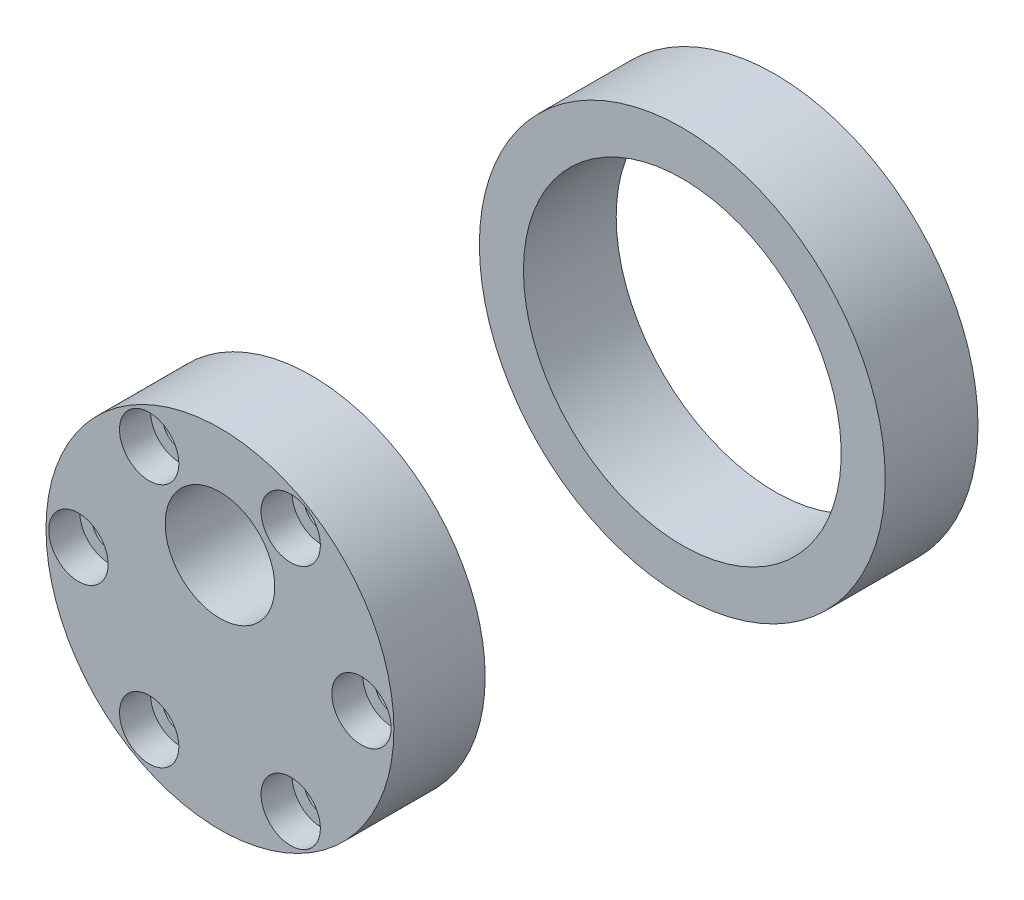
ISO-10303-21;
HEADER;
FILE_DESCRIPTION(('STEP AP214'),'2;1');
FILE_NAME('part.step','',(''),(''),'','','');
FILE_SCHEMA(('AUTOMOTIVE_DESIGN { 1 0 10303 214 1 1 1 1 }'));
ENDSEC;
DATA;
#1=APPLICATION_CONTEXT('core data for automotive mechanical design processes');
#2=APPLICATION_PROTOCOL_DEFINITION('international standard','automotive_design',2000,#1);
#3=PRODUCT_CONTEXT('',#1,'mechanical');
#4=PRODUCT('Part','Part','',(#3));
#5=PRODUCT_RELATED_PRODUCT_CATEGORY('part','',(#4));
#6=PRODUCT_DEFINITION_FORMATION('','',#4);
#7=PRODUCT_DEFINITION_CONTEXT('part definition',#1,'design');
#8=PRODUCT_DEFINITION('design','',#6,#7);
#9=PRODUCT_DEFINITION_SHAPE('','',#8);
#10=(LENGTH_UNIT() NAMED_UNIT(*) SI_UNIT(.MILLI.,.METRE.));
#11=(NAMED_UNIT(*) PLANE_ANGLE_UNIT() SI_UNIT($,.RADIAN.));
#12=(NAMED_UNIT(*) SI_UNIT($,.STERADIAN.) SOLID_ANGLE_UNIT());
#13=UNCERTAINTY_MEASURE_WITH_UNIT(LENGTH_MEASURE(1.E-05),#10,'distance_accuracy_value','');
#14=(GEOMETRIC_REPRESENTATION_CONTEXT(3) GLOBAL_UNCERTAINTY_ASSIGNED_CONTEXT((#13)) GLOBAL_UNIT_ASSIGNED_CONTEXT((#10,
#11,#12)) REPRESENTATION_CONTEXT('',''));
#15=CARTESIAN_POINT('',(0.,0.,0.));
#16=DIRECTION('',(0.,0.,1.));
#17=DIRECTION('',(1.,0.,0.));
#18=AXIS2_PLACEMENT_3D('',#15,#16,#17);
#19=CARTESIAN_POINT('',(0.,0.,-50.8));
#20=DIRECTION('',(0.,0.,-1.));
#21=DIRECTION('',(-1.,0.,0.));
#22=AXIS2_PLACEMENT_3D('',#19,#20,#21);
#23=PLANE('',#22);
#24=CARTESIAN_POINT('',(0.,0.,-50.8));
#25=DIRECTION('',(0.,0.,-1.));
#26=DIRECTION('',(-1.,0.,0.));
#27=AXIS2_PLACEMENT_3D('',#24,#25,#26);
#28=CIRCLE('',#27,22.225);
#29=CARTESIAN_POINT('',(-22.225,0.,-50.8));
#30=VERTEX_POINT('',#29);
#31=EDGE_CURVE('E11',#30,#30,#28,.T.);
#32=ORIENTED_EDGE('',*,*,#31,.T.);
#33=EDGE_LOOP('',(#32));
#34=FACE_BOUND('',#33,.T.);
#35=CARTESIAN_POINT('',(0.,0.,-50.8));
#36=DIRECTION('',(0.,0.,-1.));
#37=DIRECTION('',(-1.,0.,0.));
#38=AXIS2_PLACEMENT_3D('',#35,#36,#37);
#39=CIRCLE('',#38,17.4);
#40=CARTESIAN_POINT('',(-17.4,0.,-50.8));
#41=VERTEX_POINT('',#40);
#42=EDGE_CURVE('E61',#41,#41,#39,.T.);
#43=ORIENTED_EDGE('',*,*,#42,.F.);
#44=EDGE_LOOP('',(#43));
#45=FACE_BOUND('',#44,.T.);
#46=ADVANCED_FACE('F50',(#34,#45),#23,.T.);
#47=CARTESIAN_POINT('',(0.,0.,-40.64));
#48=DIRECTION('',(0.,0.,-1.));
#49=DIRECTION('',(-1.,0.,0.));
#50=AXIS2_PLACEMENT_3D('',#47,#48,#49);
#51=PLANE('',#50);
#52=CARTESIAN_POINT('',(0.,0.,-40.64));
#53=DIRECTION('',(0.,0.,-1.));
#54=DIRECTION('',(-1.,0.,0.));
#55=AXIS2_PLACEMENT_3D('',#52,#53,#54);
#56=CIRCLE('',#55,22.225);
#57=CARTESIAN_POINT('',(-22.225,0.,-40.64));
#58=VERTEX_POINT('',#57);
#59=EDGE_CURVE('E54',#58,#58,#56,.T.);
#60=ORIENTED_EDGE('',*,*,#59,.F.);
#61=EDGE_LOOP('',(#60));
#62=FACE_BOUND('',#61,.T.);
#63=CARTESIAN_POINT('',(0.,0.,-40.64));
#64=DIRECTION('',(0.,0.,-1.));
#65=DIRECTION('',(-1.,0.,0.));
#66=AXIS2_PLACEMENT_3D('',#63,#64,#65);
#67=CIRCLE('',#66,17.4);
#68=CARTESIAN_POINT('',(-17.4,0.,-40.64));
#69=VERTEX_POINT('',#68);
#70=EDGE_CURVE('E63',#69,#69,#67,.T.);
#71=ORIENTED_EDGE('',*,*,#70,.T.);
#72=EDGE_LOOP('',(#71));
#73=FACE_BOUND('',#72,.T.);
#74=ADVANCED_FACE('F73',(#62,#73),#51,.F.);
#75=CARTESIAN_POINT('',(0.,0.,-50.8));
#76=DIRECTION('',(0.,0.,1.));
#77=DIRECTION('',(1.,0.,0.));
#78=AXIS2_PLACEMENT_3D('',#75,#76,#77);
#79=CYLINDRICAL_SURFACE('',#78,22.225);
#80=ORIENTED_EDGE('',*,*,#31,.F.);
#81=EDGE_LOOP('',(#80));
#82=FACE_BOUND('',#81,.T.);
#83=ORIENTED_EDGE('',*,*,#59,.T.);
#84=EDGE_LOOP('',(#83));
#85=FACE_BOUND('',#84,.T.);
#86=ADVANCED_FACE('F52',(#82,#85),#79,.T.);
#87=CARTESIAN_POINT('',(0.,0.,-50.8));
#88=DIRECTION('',(0.,0.,1.));
#89=DIRECTION('',(1.,0.,0.));
#90=AXIS2_PLACEMENT_3D('',#87,#88,#89);
#91=CYLINDRICAL_SURFACE('',#90,17.4);
#92=ORIENTED_EDGE('',*,*,#42,.T.);
#93=EDGE_LOOP('',(#92));
#94=FACE_BOUND('',#93,.T.);
#95=ORIENTED_EDGE('',*,*,#70,.F.);
#96=EDGE_LOOP('',(#95));
#97=FACE_BOUND('',#96,.T.);
#98=ADVANCED_FACE('F69',(#94,#97),#91,.F.);
#99=CLOSED_SHELL('',(#46,#74,#86,#98));
#100=MANIFOLD_SOLID_BREP('B2',#99);
#101=CARTESIAN_POINT('',(0.,0.,10.));
#102=DIRECTION('',(0.,0.,1.));
#103=DIRECTION('',(1.,0.,0.));
#104=AXIS2_PLACEMENT_3D('',#101,#102,#103);
#105=PLANE('',#104);
#106=CARTESIAN_POINT('',(-7.75,-13.4233937586588,10.));
#107=DIRECTION('',(0.,0.,1.));
#108=DIRECTION('',(1.,0.,0.));
#109=AXIS2_PLACEMENT_3D('',#106,#107,#108);
#110=CIRCLE('',#109,3.25);
#111=CARTESIAN_POINT('',(-4.5,-13.4233937586588,10.));
#112=VERTEX_POINT('',#111);
#113=EDGE_CURVE('E252',#112,#112,#110,.T.);
#114=ORIENTED_EDGE('',*,*,#113,.F.);
#115=EDGE_LOOP('',(#114));
#116=FACE_BOUND('',#115,.T.);
#117=CARTESIAN_POINT('',(-15.5,0.,10.));
#118=DIRECTION('',(0.,0.,1.));
#119=DIRECTION('',(1.,0.,0.));
#120=AXIS2_PLACEMENT_3D('',#117,#118,#119);
#121=CIRCLE('',#120,3.25);
#122=CARTESIAN_POINT('',(-12.25,0.,10.));
#123=VERTEX_POINT('',#122);
#124=EDGE_CURVE('E167',#123,#123,#121,.T.);
#125=ORIENTED_EDGE('',*,*,#124,.F.);
#126=EDGE_LOOP('',(#125));
#127=FACE_BOUND('',#126,.T.);
#128=CARTESIAN_POINT('',(-7.75000000000001,13.4233937586588,10.));
#129=DIRECTION('',(0.,0.,1.));
#130=DIRECTION('',(1.,0.,0.));
#131=AXIS2_PLACEMENT_3D('',#128,#129,#130);
#132=CIRCLE('',#131,3.25);
#133=CARTESIAN_POINT('',(-4.50000000000001,13.4233937586588,10.));
#134=VERTEX_POINT('',#133);
#135=EDGE_CURVE('E158',#134,#134,#132,.T.);
#136=ORIENTED_EDGE('',*,*,#135,.F.);
#137=EDGE_LOOP('',(#136));
#138=FACE_BOUND('',#137,.T.);
#139=CARTESIAN_POINT('',(7.75,13.4233937586588,10.));
#140=DIRECTION('',(0.,0.,1.));
#141=DIRECTION('',(1.,0.,0.));
#142=AXIS2_PLACEMENT_3D('',#139,#140,#141);
#143=CIRCLE('',#142,3.25);
#144=CARTESIAN_POINT('',(11.,13.4233937586588,10.));
#145=VERTEX_POINT('',#144);
#146=EDGE_CURVE('E153',#145,#145,#143,.T.);
#147=ORIENTED_EDGE('',*,*,#146,.F.);
#148=EDGE_LOOP('',(#147));
#149=FACE_BOUND('',#148,.T.);
#150=CARTESIAN_POINT('',(15.5,0.,10.));
#151=DIRECTION('',(0.,0.,1.));
#152=DIRECTION('',(1.,0.,0.));
#153=AXIS2_PLACEMENT_3D('',#150,#151,#152);
#154=CIRCLE('',#153,3.25);
#155=CARTESIAN_POINT('',(18.75,0.,10.));
#156=VERTEX_POINT('',#155);
#157=EDGE_CURVE('E148',#156,#156,#154,.T.);
#158=ORIENTED_EDGE('',*,*,#157,.F.);
#159=EDGE_LOOP('',(#158));
#160=FACE_BOUND('',#159,.T.);
#161=CARTESIAN_POINT('',(7.75,-13.4233937586588,10.));
#162=DIRECTION('',(0.,0.,1.));
#163=DIRECTION('',(1.,0.,0.));
#164=AXIS2_PLACEMENT_3D('',#161,#162,#163);
#165=CIRCLE('',#164,3.25);
#166=CARTESIAN_POINT('',(11.,-13.4233937586588,10.));
#167=VERTEX_POINT('',#166);
#168=EDGE_CURVE('E142',#167,#167,#165,.T.);
#169=ORIENTED_EDGE('',*,*,#168,.F.);
#170=EDGE_LOOP('',(#169));
#171=FACE_BOUND('',#170,.T.);
#172=CARTESIAN_POINT('',(0.,0.,10.));
#173=DIRECTION('',(0.,0.,1.));
#174=DIRECTION('',(1.,0.,0.));
#175=AXIS2_PLACEMENT_3D('',#172,#173,#174);
#176=CIRCLE('',#175,19.05);
#177=CARTESIAN_POINT('',(19.05,0.,10.));
#178=VERTEX_POINT('',#177);
#179=EDGE_CURVE('E49',#178,#178,#176,.T.);
#180=ORIENTED_EDGE('',*,*,#179,.T.);
#181=EDGE_LOOP('',(#180));
#182=FACE_BOUND('',#181,.T.);
#183=CARTESIAN_POINT('',(0.,7.,10.));
#184=DIRECTION('',(0.,0.,1.));
#185=DIRECTION('',(1.,0.,0.));
#186=AXIS2_PLACEMENT_3D('',#183,#184,#185);
#187=CIRCLE('',#186,6.);
#188=CARTESIAN_POINT('',(6.,7.,10.));
#189=VERTEX_POINT('',#188);
#190=EDGE_CURVE('E126',#189,#189,#187,.T.);
#191=ORIENTED_EDGE('',*,*,#190,.F.);
#192=EDGE_LOOP('',(#191));
#193=FACE_BOUND('',#192,.T.);
#194=ADVANCED_FACE('F111',(#116,#127,#138,#149,#160,#171,#182,#193),#105,.T.);
#195=CARTESIAN_POINT('',(0.,0.,0.));
#196=DIRECTION('',(0.,0.,1.));
#197=DIRECTION('',(1.,0.,0.));
#198=AXIS2_PLACEMENT_3D('',#195,#196,#197);
#199=PLANE('',#198);
#200=CARTESIAN_POINT('',(0.,0.,0.));
#201=DIRECTION('',(0.,0.,1.));
#202=DIRECTION('',(1.,0.,0.));
#203=AXIS2_PLACEMENT_3D('',#200,#201,#202);
#204=CIRCLE('',#203,19.05);
#205=CARTESIAN_POINT('',(19.05,0.,0.));
#206=VERTEX_POINT('',#205);
#207=EDGE_CURVE('E120',#206,#206,#204,.T.);
#208=ORIENTED_EDGE('',*,*,#207,.F.);
#209=EDGE_LOOP('',(#208));
#210=FACE_BOUND('',#209,.T.);
#211=CARTESIAN_POINT('',(0.,7.,0.));
#212=DIRECTION('',(0.,0.,1.));
#213=DIRECTION('',(1.,0.,0.));
#214=AXIS2_PLACEMENT_3D('',#211,#212,#213);
#215=CIRCLE('',#214,6.);
#216=CARTESIAN_POINT('',(6.,7.,0.));
#217=VERTEX_POINT('',#216);
#218=EDGE_CURVE('E129',#217,#217,#215,.T.);
#219=ORIENTED_EDGE('',*,*,#218,.T.);
#220=EDGE_LOOP('',(#219));
#221=FACE_BOUND('',#220,.T.);
#222=CARTESIAN_POINT('',(15.5,0.,0.));
#223=DIRECTION('',(0.,0.,1.));
#224=DIRECTION('',(1.,0.,0.));
#225=AXIS2_PLACEMENT_3D('',#222,#223,#224);
#226=CIRCLE('',#225,1.905);
#227=CARTESIAN_POINT('',(17.405,0.,0.));
#228=VERTEX_POINT('',#227);
#229=EDGE_CURVE('E216',#228,#228,#226,.T.);
#230=ORIENTED_EDGE('',*,*,#229,.T.);
#231=EDGE_LOOP('',(#230));
#232=FACE_BOUND('',#231,.T.);
#233=CARTESIAN_POINT('',(7.75,-13.4233937586588,0.));
#234=DIRECTION('',(0.,0.,1.));
#235=DIRECTION('',(1.,0.,0.));
#236=AXIS2_PLACEMENT_3D('',#233,#234,#235);
#237=CIRCLE('',#236,1.905);
#238=CARTESIAN_POINT('',(9.655,-13.4233937586588,0.));
#239=VERTEX_POINT('',#238);
#240=EDGE_CURVE('E212',#239,#239,#237,.T.);
#241=ORIENTED_EDGE('',*,*,#240,.T.);
#242=EDGE_LOOP('',(#241));
#243=FACE_BOUND('',#242,.T.);
#244=CARTESIAN_POINT('',(-7.75,-13.4233937586588,0.));
#245=DIRECTION('',(0.,0.,1.));
#246=DIRECTION('',(1.,0.,0.));
#247=AXIS2_PLACEMENT_3D('',#244,#245,#246);
#248=CIRCLE('',#247,1.905);
#249=CARTESIAN_POINT('',(-5.845,-13.4233937586588,0.));
#250=VERTEX_POINT('',#249);
#251=EDGE_CURVE('E208',#250,#250,#248,.T.);
#252=ORIENTED_EDGE('',*,*,#251,.T.);
#253=EDGE_LOOP('',(#252));
#254=FACE_BOUND('',#253,.T.);
#255=CARTESIAN_POINT('',(-15.5,0.,0.));
#256=DIRECTION('',(0.,0.,1.));
#257=DIRECTION('',(1.,0.,0.));
#258=AXIS2_PLACEMENT_3D('',#255,#256,#257);
#259=CIRCLE('',#258,1.905);
#260=CARTESIAN_POINT('',(-13.595,0.,0.));
#261=VERTEX_POINT('',#260);
#262=EDGE_CURVE('E204',#261,#261,#259,.T.);
#263=ORIENTED_EDGE('',*,*,#262,.T.);
#264=EDGE_LOOP('',(#263));
#265=FACE_BOUND('',#264,.T.);
#266=CARTESIAN_POINT('',(-7.75000000000001,13.4233937586588,0.));
#267=DIRECTION('',(0.,0.,1.));
#268=DIRECTION('',(1.,0.,0.));
#269=AXIS2_PLACEMENT_3D('',#266,#267,#268);
#270=CIRCLE('',#269,1.905);
#271=CARTESIAN_POINT('',(-5.84500000000001,13.4233937586588,0.));
#272=VERTEX_POINT('',#271);
#273=EDGE_CURVE('E200',#272,#272,#270,.T.);
#274=ORIENTED_EDGE('',*,*,#273,.T.);
#275=EDGE_LOOP('',(#274));
#276=FACE_BOUND('',#275,.T.);
#277=CARTESIAN_POINT('',(7.75,13.4233937586588,0.));
#278=DIRECTION('',(0.,0.,1.));
#279=DIRECTION('',(1.,0.,0.));
#280=AXIS2_PLACEMENT_3D('',#277,#278,#279);
#281=CIRCLE('',#280,1.905);
#282=CARTESIAN_POINT('',(9.655,13.4233937586588,0.));
#283=VERTEX_POINT('',#282);
#284=EDGE_CURVE('E136',#283,#283,#281,.T.);
#285=ORIENTED_EDGE('',*,*,#284,.T.);
#286=EDGE_LOOP('',(#285));
#287=FACE_BOUND('',#286,.T.);
#288=ADVANCED_FACE('F227',(#210,#221,#232,#243,#254,#265,#276,#287),#199,.F.);
#289=CARTESIAN_POINT('',(0.,0.,10.));
#290=DIRECTION('',(0.,0.,-1.));
#291=DIRECTION('',(-1.,0.,0.));
#292=AXIS2_PLACEMENT_3D('',#289,#290,#291);
#293=CYLINDRICAL_SURFACE('',#292,19.05);
#294=ORIENTED_EDGE('',*,*,#179,.F.);
#295=EDGE_LOOP('',(#294));
#296=FACE_BOUND('',#295,.T.);
#297=ORIENTED_EDGE('',*,*,#207,.T.);
#298=EDGE_LOOP('',(#297));
#299=FACE_BOUND('',#298,.T.);
#300=ADVANCED_FACE('F113',(#296,#299),#293,.T.);
#301=CARTESIAN_POINT('',(0.,7.,10.));
#302=DIRECTION('',(0.,0.,-1.));
#303=DIRECTION('',(-1.,0.,0.));
#304=AXIS2_PLACEMENT_3D('',#301,#302,#303);
#305=CYLINDRICAL_SURFACE('',#304,6.);
#306=ORIENTED_EDGE('',*,*,#190,.T.);
#307=EDGE_LOOP('',(#306));
#308=FACE_BOUND('',#307,.T.);
#309=ORIENTED_EDGE('',*,*,#218,.F.);
#310=EDGE_LOOP('',(#309));
#311=FACE_BOUND('',#310,.T.);
#312=ADVANCED_FACE('F230',(#308,#311),#305,.F.);
#313=CARTESIAN_POINT('',(15.5,0.,10.));
#314=DIRECTION('',(0.,0.,-1.));
#315=DIRECTION('',(-1.,0.,0.));
#316=AXIS2_PLACEMENT_3D('',#313,#314,#315);
#317=CYLINDRICAL_SURFACE('',#316,1.905);
#318=CARTESIAN_POINT('',(15.5,0.,6.6));
#319=DIRECTION('',(0.,0.,-1.));
#320=DIRECTION('',(-1.,0.,0.));
#321=AXIS2_PLACEMENT_3D('',#318,#319,#320);
#322=CIRCLE('',#321,1.905);
#323=CARTESIAN_POINT('',(13.595,0.,6.6));
#324=VERTEX_POINT('',#323);
#325=EDGE_CURVE('E138',#324,#324,#322,.T.);
#326=ORIENTED_EDGE('',*,*,#325,.F.);
#327=EDGE_LOOP('',(#326));
#328=FACE_BOUND('',#327,.T.);
#329=ORIENTED_EDGE('',*,*,#229,.F.);
#330=EDGE_LOOP('',(#329));
#331=FACE_BOUND('',#330,.T.);
#332=ADVANCED_FACE('F232',(#328,#331),#317,.F.);
#333=CARTESIAN_POINT('',(7.75,-13.4233937586588,10.));
#334=DIRECTION('',(0.,0.,-1.));
#335=DIRECTION('',(-1.,0.,0.));
#336=AXIS2_PLACEMENT_3D('',#333,#334,#335);
#337=CYLINDRICAL_SURFACE('',#336,1.905);
#338=CARTESIAN_POINT('',(7.75,-13.4233937586588,6.6));
#339=DIRECTION('',(0.,0.,-1.));
#340=DIRECTION('',(-1.,0.,0.));
#341=AXIS2_PLACEMENT_3D('',#338,#339,#340);
#342=CIRCLE('',#341,1.905);
#343=CARTESIAN_POINT('',(5.845,-13.4233937586588,6.6));
#344=VERTEX_POINT('',#343);
#345=EDGE_CURVE('E132',#344,#344,#342,.T.);
#346=ORIENTED_EDGE('',*,*,#345,.F.);
#347=EDGE_LOOP('',(#346));
#348=FACE_BOUND('',#347,.T.);
#349=ORIENTED_EDGE('',*,*,#240,.F.);
#350=EDGE_LOOP('',(#349));
#351=FACE_BOUND('',#350,.T.);
#352=ADVANCED_FACE('F239',(#348,#351),#337,.F.);
#353=CARTESIAN_POINT('',(-7.75,-13.4233937586588,10.));
#354=DIRECTION('',(0.,0.,-1.));
#355=DIRECTION('',(-1.,0.,0.));
#356=AXIS2_PLACEMENT_3D('',#353,#354,#355);
#357=CYLINDRICAL_SURFACE('',#356,1.905);
#358=CARTESIAN_POINT('',(-7.75,-13.4233937586588,6.6));
#359=DIRECTION('',(0.,0.,-1.));
#360=DIRECTION('',(-1.,0.,0.));
#361=AXIS2_PLACEMENT_3D('',#358,#359,#360);
#362=CIRCLE('',#361,1.905);
#363=CARTESIAN_POINT('',(-9.655,-13.4233937586588,6.6));
#364=VERTEX_POINT('',#363);
#365=EDGE_CURVE('E115',#364,#364,#362,.T.);
#366=ORIENTED_EDGE('',*,*,#365,.F.);
#367=EDGE_LOOP('',(#366));
#368=FACE_BOUND('',#367,.T.);
#369=ORIENTED_EDGE('',*,*,#251,.F.);
#370=EDGE_LOOP('',(#369));
#371=FACE_BOUND('',#370,.T.);
#372=ADVANCED_FACE('F293',(#368,#371),#357,.F.);
#373=CARTESIAN_POINT('',(-15.5,0.,10.));
#374=DIRECTION('',(0.,0.,-1.));
#375=DIRECTION('',(-1.,0.,0.));
#376=AXIS2_PLACEMENT_3D('',#373,#374,#375);
#377=CYLINDRICAL_SURFACE('',#376,1.905);
#378=CARTESIAN_POINT('',(-15.5,0.,6.6));
#379=DIRECTION('',(0.,0.,-1.));
#380=DIRECTION('',(-1.,0.,0.));
#381=AXIS2_PLACEMENT_3D('',#378,#379,#380);
#382=CIRCLE('',#381,1.905);
#383=CARTESIAN_POINT('',(-17.405,0.,6.6));
#384=VERTEX_POINT('',#383);
#385=EDGE_CURVE('E155',#384,#384,#382,.T.);
#386=ORIENTED_EDGE('',*,*,#385,.F.);
#387=EDGE_LOOP('',(#386));
#388=FACE_BOUND('',#387,.T.);
#389=ORIENTED_EDGE('',*,*,#262,.F.);
#390=EDGE_LOOP('',(#389));
#391=FACE_BOUND('',#390,.T.);
#392=ADVANCED_FACE('F289',(#388,#391),#377,.F.);
#393=CARTESIAN_POINT('',(-7.75000000000001,13.4233937586588,10.));
#394=DIRECTION('',(0.,0.,-1.));
#395=DIRECTION('',(-1.,0.,0.));
#396=AXIS2_PLACEMENT_3D('',#393,#394,#395);
#397=CYLINDRICAL_SURFACE('',#396,1.905);
#398=CARTESIAN_POINT('',(-7.75000000000001,13.4233937586588,6.6));
#399=DIRECTION('',(0.,0.,-1.));
#400=DIRECTION('',(-1.,0.,0.));
#401=AXIS2_PLACEMENT_3D('',#398,#399,#400);
#402=CIRCLE('',#401,1.905);
#403=CARTESIAN_POINT('',(-9.65500000000001,13.4233937586588,6.6));
#404=VERTEX_POINT('',#403);
#405=EDGE_CURVE('E150',#404,#404,#402,.T.);
#406=ORIENTED_EDGE('',*,*,#405,.F.);
#407=EDGE_LOOP('',(#406));
#408=FACE_BOUND('',#407,.T.);
#409=ORIENTED_EDGE('',*,*,#273,.F.);
#410=EDGE_LOOP('',(#409));
#411=FACE_BOUND('',#410,.T.);
#412=ADVANCED_FACE('F285',(#408,#411),#397,.F.);
#413=CARTESIAN_POINT('',(7.75,13.4233937586588,10.));
#414=DIRECTION('',(0.,0.,-1.));
#415=DIRECTION('',(-1.,0.,0.));
#416=AXIS2_PLACEMENT_3D('',#413,#414,#415);
#417=CYLINDRICAL_SURFACE('',#416,1.905);
#418=CARTESIAN_POINT('',(7.75,13.4233937586588,6.6));
#419=DIRECTION('',(0.,0.,-1.));
#420=DIRECTION('',(-1.,0.,0.));
#421=AXIS2_PLACEMENT_3D('',#418,#419,#420);
#422=CIRCLE('',#421,1.905);
#423=CARTESIAN_POINT('',(5.845,13.4233937586588,6.6));
#424=VERTEX_POINT('',#423);
#425=EDGE_CURVE('E144',#424,#424,#422,.T.);
#426=ORIENTED_EDGE('',*,*,#425,.F.);
#427=EDGE_LOOP('',(#426));
#428=FACE_BOUND('',#427,.T.);
#429=ORIENTED_EDGE('',*,*,#284,.F.);
#430=EDGE_LOOP('',(#429));
#431=FACE_BOUND('',#430,.T.);
#432=ADVANCED_FACE('F277',(#428,#431),#417,.F.);
#433=CARTESIAN_POINT('',(9.45,-13.4233937586588,6.6));
#434=DIRECTION('',(0.,0.,-1.));
#435=DIRECTION('',(-1.,0.,0.));
#436=AXIS2_PLACEMENT_3D('',#433,#434,#435);
#437=PLANE('',#436);
#438=ORIENTED_EDGE('',*,*,#345,.T.);
#439=EDGE_LOOP('',(#438));
#440=FACE_BOUND('',#439,.T.);
#441=CARTESIAN_POINT('',(7.75,-13.4233937586588,6.6));
#442=DIRECTION('',(0.,0.,1.));
#443=DIRECTION('',(1.,0.,0.));
#444=AXIS2_PLACEMENT_3D('',#441,#442,#443);
#445=CIRCLE('',#444,3.25);
#446=CARTESIAN_POINT('',(11.,-13.4233937586588,6.6));
#447=VERTEX_POINT('',#446);
#448=EDGE_CURVE('E137',#447,#447,#445,.T.);
#449=ORIENTED_EDGE('',*,*,#448,.T.);
#450=EDGE_LOOP('',(#449));
#451=FACE_BOUND('',#450,.T.);
#452=ADVANCED_FACE('F267',(#440,#451),#437,.F.);
#453=CARTESIAN_POINT('',(7.75,-13.4233937586588,10.));
#454=DIRECTION('',(0.,0.,1.));
#455=DIRECTION('',(1.,0.,0.));
#456=AXIS2_PLACEMENT_3D('',#453,#454,#455);
#457=CYLINDRICAL_SURFACE('',#456,3.25);
#458=ORIENTED_EDGE('',*,*,#448,.F.);
#459=EDGE_LOOP('',(#458));
#460=FACE_BOUND('',#459,.T.);
#461=ORIENTED_EDGE('',*,*,#168,.T.);
#462=EDGE_LOOP('',(#461));
#463=FACE_BOUND('',#462,.T.);
#464=ADVANCED_FACE('F264',(#460,#463),#457,.F.);
#465=CARTESIAN_POINT('',(17.2,0.,6.6));
#466=DIRECTION('',(0.,0.,-1.));
#467=DIRECTION('',(-1.,0.,0.));
#468=AXIS2_PLACEMENT_3D('',#465,#466,#467);
#469=PLANE('',#468);
#470=ORIENTED_EDGE('',*,*,#325,.T.);
#471=EDGE_LOOP('',(#470));
#472=FACE_BOUND('',#471,.T.);
#473=CARTESIAN_POINT('',(15.5,0.,6.6));
#474=DIRECTION('',(0.,0.,1.));
#475=DIRECTION('',(1.,0.,0.));
#476=AXIS2_PLACEMENT_3D('',#473,#474,#475);
#477=CIRCLE('',#476,3.25);
#478=CARTESIAN_POINT('',(18.75,0.,6.6));
#479=VERTEX_POINT('',#478);
#480=EDGE_CURVE('E143',#479,#479,#477,.T.);
#481=ORIENTED_EDGE('',*,*,#480,.T.);
#482=EDGE_LOOP('',(#481));
#483=FACE_BOUND('',#482,.T.);
#484=ADVANCED_FACE('F266',(#472,#483),#469,.F.);
#485=CARTESIAN_POINT('',(15.5,0.,10.));
#486=DIRECTION('',(0.,0.,1.));
#487=DIRECTION('',(1.,0.,0.));
#488=AXIS2_PLACEMENT_3D('',#485,#486,#487);
#489=CYLINDRICAL_SURFACE('',#488,3.25);
#490=ORIENTED_EDGE('',*,*,#480,.F.);
#491=EDGE_LOOP('',(#490));
#492=FACE_BOUND('',#491,.T.);
#493=ORIENTED_EDGE('',*,*,#157,.T.);
#494=EDGE_LOOP('',(#493));
#495=FACE_BOUND('',#494,.T.);
#496=ADVANCED_FACE('F274',(#492,#495),#489,.F.);
#497=CARTESIAN_POINT('',(9.45,13.4233937586588,6.6));
#498=DIRECTION('',(0.,0.,-1.));
#499=DIRECTION('',(-1.,0.,0.));
#500=AXIS2_PLACEMENT_3D('',#497,#498,#499);
#501=PLANE('',#500);
#502=ORIENTED_EDGE('',*,*,#425,.T.);
#503=EDGE_LOOP('',(#502));
#504=FACE_BOUND('',#503,.T.);
#505=CARTESIAN_POINT('',(7.75,13.4233937586588,6.6));
#506=DIRECTION('',(0.,0.,1.));
#507=DIRECTION('',(1.,0.,0.));
#508=AXIS2_PLACEMENT_3D('',#505,#506,#507);
#509=CIRCLE('',#508,3.25);
#510=CARTESIAN_POINT('',(11.,13.4233937586588,6.6));
#511=VERTEX_POINT('',#510);
#512=EDGE_CURVE('E149',#511,#511,#509,.T.);
#513=ORIENTED_EDGE('',*,*,#512,.T.);
#514=EDGE_LOOP('',(#513));
#515=FACE_BOUND('',#514,.T.);
#516=ADVANCED_FACE('F366',(#504,#515),#501,.F.);
#517=CARTESIAN_POINT('',(7.75,13.4233937586588,10.));
#518=DIRECTION('',(0.,0.,1.));
#519=DIRECTION('',(1.,0.,0.));
#520=AXIS2_PLACEMENT_3D('',#517,#518,#519);
#521=CYLINDRICAL_SURFACE('',#520,3.25);
#522=ORIENTED_EDGE('',*,*,#512,.F.);
#523=EDGE_LOOP('',(#522));
#524=FACE_BOUND('',#523,.T.);
#525=ORIENTED_EDGE('',*,*,#146,.T.);
#526=EDGE_LOOP('',(#525));
#527=FACE_BOUND('',#526,.T.);
#528=ADVANCED_FACE('F375',(#524,#527),#521,.F.);
#529=CARTESIAN_POINT('',(-6.05000000000001,13.4233937586588,6.6));
#530=DIRECTION('',(0.,0.,-1.));
#531=DIRECTION('',(-1.,0.,0.));
#532=AXIS2_PLACEMENT_3D('',#529,#530,#531);
#533=PLANE('',#532);
#534=ORIENTED_EDGE('',*,*,#405,.T.);
#535=EDGE_LOOP('',(#534));
#536=FACE_BOUND('',#535,.T.);
#537=CARTESIAN_POINT('',(-7.75000000000001,13.4233937586588,6.6));
#538=DIRECTION('',(0.,0.,1.));
#539=DIRECTION('',(1.,0.,0.));
#540=AXIS2_PLACEMENT_3D('',#537,#538,#539);
#541=CIRCLE('',#540,3.25);
#542=CARTESIAN_POINT('',(-4.50000000000001,13.4233937586588,6.6));
#543=VERTEX_POINT('',#542);
#544=EDGE_CURVE('E154',#543,#543,#541,.T.);
#545=ORIENTED_EDGE('',*,*,#544,.T.);
#546=EDGE_LOOP('',(#545));
#547=FACE_BOUND('',#546,.T.);
#548=ADVANCED_FACE('F385',(#536,#547),#533,.F.);
#549=CARTESIAN_POINT('',(-7.75000000000001,13.4233937586588,10.));
#550=DIRECTION('',(0.,0.,1.));
#551=DIRECTION('',(1.,0.,0.));
#552=AXIS2_PLACEMENT_3D('',#549,#550,#551);
#553=CYLINDRICAL_SURFACE('',#552,3.25);
#554=ORIENTED_EDGE('',*,*,#544,.F.);
#555=EDGE_LOOP('',(#554));
#556=FACE_BOUND('',#555,.T.);
#557=ORIENTED_EDGE('',*,*,#135,.T.);
#558=EDGE_LOOP('',(#557));
#559=FACE_BOUND('',#558,.T.);
#560=ADVANCED_FACE('F395',(#556,#559),#553,.F.);
#561=CARTESIAN_POINT('',(-13.8,0.,6.6));
#562=DIRECTION('',(0.,0.,-1.));
#563=DIRECTION('',(-1.,0.,0.));
#564=AXIS2_PLACEMENT_3D('',#561,#562,#563);
#565=PLANE('',#564);
#566=ORIENTED_EDGE('',*,*,#385,.T.);
#567=EDGE_LOOP('',(#566));
#568=FACE_BOUND('',#567,.T.);
#569=CARTESIAN_POINT('',(-15.5,0.,6.6));
#570=DIRECTION('',(0.,0.,1.));
#571=DIRECTION('',(1.,0.,0.));
#572=AXIS2_PLACEMENT_3D('',#569,#570,#571);
#573=CIRCLE('',#572,3.25);
#574=CARTESIAN_POINT('',(-12.25,0.,6.6));
#575=VERTEX_POINT('',#574);
#576=EDGE_CURVE('E159',#575,#575,#573,.T.);
#577=ORIENTED_EDGE('',*,*,#576,.T.);
#578=EDGE_LOOP('',(#577));
#579=FACE_BOUND('',#578,.T.);
#580=ADVANCED_FACE('F405',(#568,#579),#565,.F.);
#581=CARTESIAN_POINT('',(-15.5,0.,10.));
#582=DIRECTION('',(0.,0.,1.));
#583=DIRECTION('',(1.,0.,0.));
#584=AXIS2_PLACEMENT_3D('',#581,#582,#583);
#585=CYLINDRICAL_SURFACE('',#584,3.25);
#586=ORIENTED_EDGE('',*,*,#576,.F.);
#587=EDGE_LOOP('',(#586));
#588=FACE_BOUND('',#587,.T.);
#589=ORIENTED_EDGE('',*,*,#124,.T.);
#590=EDGE_LOOP('',(#589));
#591=FACE_BOUND('',#590,.T.);
#592=ADVANCED_FACE('F415',(#588,#591),#585,.F.);
#593=CARTESIAN_POINT('',(-6.05,-13.4233937586588,6.6));
#594=DIRECTION('',(0.,0.,-1.));
#595=DIRECTION('',(-1.,0.,0.));
#596=AXIS2_PLACEMENT_3D('',#593,#594,#595);
#597=PLANE('',#596);
#598=ORIENTED_EDGE('',*,*,#365,.T.);
#599=EDGE_LOOP('',(#598));
#600=FACE_BOUND('',#599,.T.);
#601=CARTESIAN_POINT('',(-7.75,-13.4233937586588,6.6));
#602=DIRECTION('',(0.,0.,1.));
#603=DIRECTION('',(1.,0.,0.));
#604=AXIS2_PLACEMENT_3D('',#601,#602,#603);
#605=CIRCLE('',#604,3.25);
#606=CARTESIAN_POINT('',(-4.5,-13.4233937586588,6.6));
#607=VERTEX_POINT('',#606);
#608=EDGE_CURVE('E450',#607,#607,#605,.T.);
#609=ORIENTED_EDGE('',*,*,#608,.T.);
#610=EDGE_LOOP('',(#609));
#611=FACE_BOUND('',#610,.T.);
#612=ADVANCED_FACE('F424',(#600,#611),#597,.F.);
#613=CARTESIAN_POINT('',(-7.75,-13.4233937586588,10.));
#614=DIRECTION('',(0.,0.,1.));
#615=DIRECTION('',(1.,0.,0.));
#616=AXIS2_PLACEMENT_3D('',#613,#614,#615);
#617=CYLINDRICAL_SURFACE('',#616,3.25);
#618=ORIENTED_EDGE('',*,*,#608,.F.);
#619=EDGE_LOOP('',(#618));
#620=FACE_BOUND('',#619,.T.);
#621=ORIENTED_EDGE('',*,*,#113,.T.);
#622=EDGE_LOOP('',(#621));
#623=FACE_BOUND('',#622,.T.);
#624=ADVANCED_FACE('F434',(#620,#623),#617,.F.);
#625=CLOSED_SHELL('',(#194,#288,#300,#312,#332,#352,#372,#392,#412,#432,#452,#464,#484,#496,
#516,#528,#548,#560,#580,#592,#612,#624));
#626=MANIFOLD_SOLID_BREP('B6',#625);
#627=ADVANCED_BREP_SHAPE_REPRESENTATION('',(#18,#100,#626),#14);
#628=SHAPE_DEFINITION_REPRESENTATION(#9,#627);
ENDSEC;
END-ISO-10303-21;
